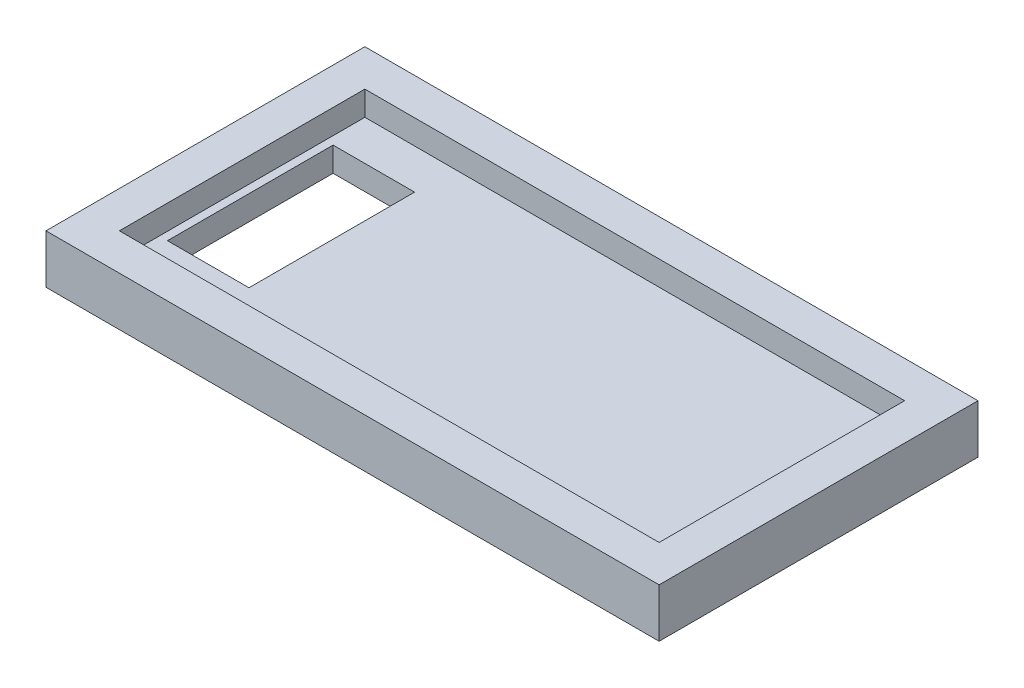
ISO-10303-21;
HEADER;
FILE_DESCRIPTION(('STEP AP214'),'2;1');
FILE_NAME('part.step','',(''),(''),'','','');
FILE_SCHEMA(('AUTOMOTIVE_DESIGN { 1 0 10303 214 1 1 1 1 }'));
ENDSEC;
DATA;
#1=APPLICATION_CONTEXT('core data for automotive mechanical design processes');
#2=APPLICATION_PROTOCOL_DEFINITION('international standard','automotive_design',2000,#1);
#3=PRODUCT_CONTEXT('',#1,'mechanical');
#4=PRODUCT('Part','Part','',(#3));
#5=PRODUCT_RELATED_PRODUCT_CATEGORY('part','',(#4));
#6=PRODUCT_DEFINITION_FORMATION('','',#4);
#7=PRODUCT_DEFINITION_CONTEXT('part definition',#1,'design');
#8=PRODUCT_DEFINITION('design','',#6,#7);
#9=PRODUCT_DEFINITION_SHAPE('','',#8);
#10=(LENGTH_UNIT() NAMED_UNIT(*) SI_UNIT(.MILLI.,.METRE.));
#11=(NAMED_UNIT(*) PLANE_ANGLE_UNIT() SI_UNIT($,.RADIAN.));
#12=(NAMED_UNIT(*) SI_UNIT($,.STERADIAN.) SOLID_ANGLE_UNIT());
#13=UNCERTAINTY_MEASURE_WITH_UNIT(LENGTH_MEASURE(1.E-05),#10,'distance_accuracy_value','');
#14=(GEOMETRIC_REPRESENTATION_CONTEXT(3) GLOBAL_UNCERTAINTY_ASSIGNED_CONTEXT((#13)) GLOBAL_UNIT_ASSIGNED_CONTEXT((#10,
#11,#12)) REPRESENTATION_CONTEXT('',''));
#15=CARTESIAN_POINT('',(0.,0.,0.));
#16=DIRECTION('',(0.,0.,1.));
#17=DIRECTION('',(1.,0.,0.));
#18=AXIS2_PLACEMENT_3D('',#15,#16,#17);
#19=CARTESIAN_POINT('',(0.,0.,0.));
#20=DIRECTION('',(0.,-1.,0.));
#21=DIRECTION('',(0.,0.,-1.));
#22=AXIS2_PLACEMENT_3D('',#19,#20,#21);
#23=PLANE('',#22);
#24=CARTESIAN_POINT('',(-17.68,0.,-8.65499999999999));
#25=DIRECTION('',(0.,1.,0.));
#26=DIRECTION('',(0.,0.,1.));
#27=AXIS2_PLACEMENT_3D('',#24,#25,#26);
#28=CIRCLE('',#27,0.750000000000002);
#29=CARTESIAN_POINT('',(-17.68,0.,-7.90499999999998));
#30=VERTEX_POINT('',#29);
#31=EDGE_CURVE('E414',#30,#30,#28,.T.);
#32=ORIENTED_EDGE('',*,*,#31,.T.);
#33=EDGE_LOOP('',(#32));
#34=FACE_BOUND('',#33,.T.);
#35=CARTESIAN_POINT('',(17.68,0.,-8.655));
#36=DIRECTION('',(0.,1.,0.));
#37=DIRECTION('',(0.,0.,1.));
#38=AXIS2_PLACEMENT_3D('',#35,#36,#37);
#39=CIRCLE('',#38,0.750000000000002);
#40=CARTESIAN_POINT('',(17.68,0.,-7.90499999999999));
#41=VERTEX_POINT('',#40);
#42=EDGE_CURVE('E413',#41,#41,#39,.T.);
#43=ORIENTED_EDGE('',*,*,#42,.T.);
#44=EDGE_LOOP('',(#43));
#45=FACE_BOUND('',#44,.T.);
#46=CARTESIAN_POINT('',(17.68,0.,8.655));
#47=DIRECTION('',(0.,1.,0.));
#48=DIRECTION('',(0.,0.,1.));
#49=AXIS2_PLACEMENT_3D('',#46,#47,#48);
#50=CIRCLE('',#49,0.750000000000002);
#51=CARTESIAN_POINT('',(17.68,0.,9.405));
#52=VERTEX_POINT('',#51);
#53=EDGE_CURVE('E429',#52,#52,#50,.T.);
#54=ORIENTED_EDGE('',*,*,#53,.T.);
#55=EDGE_LOOP('',(#54));
#56=FACE_BOUND('',#55,.T.);
#57=CARTESIAN_POINT('',(-17.68,0.,8.655));
#58=DIRECTION('',(0.,1.,0.));
#59=DIRECTION('',(0.,0.,1.));
#60=AXIS2_PLACEMENT_3D('',#57,#58,#59);
#61=CIRCLE('',#60,0.750000000000002);
#62=CARTESIAN_POINT('',(-17.68,0.,9.405));
#63=VERTEX_POINT('',#62);
#64=EDGE_CURVE('E423',#63,#63,#61,.T.);
#65=ORIENTED_EDGE('',*,*,#64,.T.);
#66=EDGE_LOOP('',(#65));
#67=FACE_BOUND('',#66,.T.);
#68=DIRECTION('',(0.,0.,-1.));
#69=VECTOR('',#68,1.);
#70=CARTESIAN_POINT('',(18.805,0.,9.78));
#71=LINE('',#70,#69);
#72=CARTESIAN_POINT('',(18.805,0.,9.78));
#73=VERTEX_POINT('',#72);
#74=CARTESIAN_POINT('',(18.805,0.,-9.78));
#75=VERTEX_POINT('',#74);
#76=EDGE_CURVE('E185',#73,#75,#71,.T.);
#77=ORIENTED_EDGE('',*,*,#76,.F.);
#78=DIRECTION('',(1.,0.,0.));
#79=VECTOR('',#78,1.);
#80=CARTESIAN_POINT('',(-18.805,0.,9.78));
#81=LINE('',#80,#79);
#82=CARTESIAN_POINT('',(-18.805,0.,9.78));
#83=VERTEX_POINT('',#82);
#84=EDGE_CURVE('E196',#83,#73,#81,.T.);
#85=ORIENTED_EDGE('',*,*,#84,.F.);
#86=DIRECTION('',(0.,0.,1.));
#87=VECTOR('',#86,1.);
#88=CARTESIAN_POINT('',(-18.805,0.,9.78));
#89=LINE('',#88,#87);
#90=CARTESIAN_POINT('',(-18.805,0.,-9.78));
#91=VERTEX_POINT('',#90);
#92=EDGE_CURVE('E207',#91,#83,#89,.T.);
#93=ORIENTED_EDGE('',*,*,#92,.F.);
#94=DIRECTION('',(-1.,0.,0.));
#95=VECTOR('',#94,1.);
#96=CARTESIAN_POINT('',(-18.805,0.,-9.78));
#97=LINE('',#96,#95);
#98=EDGE_CURVE('E205',#75,#91,#97,.T.);
#99=ORIENTED_EDGE('',*,*,#98,.F.);
#100=EDGE_LOOP('',(#77,#85,#93,#99));
#101=FACE_BOUND('',#100,.T.);
#102=DIRECTION('',(-1.,0.,0.));
#103=VECTOR('',#102,1.);
#104=CARTESIAN_POINT('',(0.,0.,5.08));
#105=LINE('',#104,#103);
#106=CARTESIAN_POINT('',(-11.055,0.,5.08));
#107=VERTEX_POINT('',#106);
#108=CARTESIAN_POINT('',(-16.055,0.,5.08));
#109=VERTEX_POINT('',#108);
#110=EDGE_CURVE('E130',#107,#109,#105,.T.);
#111=ORIENTED_EDGE('',*,*,#110,.F.);
#112=DIRECTION('',(0.,0.,1.));
#113=VECTOR('',#112,1.);
#114=CARTESIAN_POINT('',(-11.055,0.,0.));
#115=LINE('',#114,#113);
#116=CARTESIAN_POINT('',(-11.055,0.,-5.08));
#117=VERTEX_POINT('',#116);
#118=EDGE_CURVE('E122',#117,#107,#115,.T.);
#119=ORIENTED_EDGE('',*,*,#118,.F.);
#120=DIRECTION('',(1.,0.,0.));
#121=VECTOR('',#120,1.);
#122=CARTESIAN_POINT('',(0.,0.,-5.08));
#123=LINE('',#122,#121);
#124=CARTESIAN_POINT('',(-16.055,0.,-5.08));
#125=VERTEX_POINT('',#124);
#126=EDGE_CURVE('E144',#125,#117,#123,.T.);
#127=ORIENTED_EDGE('',*,*,#126,.F.);
#128=DIRECTION('',(0.,0.,-1.));
#129=VECTOR('',#128,1.);
#130=CARTESIAN_POINT('',(-16.055,0.,0.));
#131=LINE('',#130,#129);
#132=EDGE_CURVE('E142',#109,#125,#131,.T.);
#133=ORIENTED_EDGE('',*,*,#132,.F.);
#134=EDGE_LOOP('',(#111,#119,#127,#133));
#135=FACE_BOUND('',#134,.T.);
#136=ADVANCED_FACE('F33',(#34,#45,#56,#67,#101,#135),#23,.T.);
#137=CARTESIAN_POINT('',(0.,1.5,0.));
#138=DIRECTION('',(0.,1.,0.));
#139=DIRECTION('',(0.,0.,1.));
#140=AXIS2_PLACEMENT_3D('',#137,#138,#139);
#141=PLANE('',#140);
#142=DIRECTION('',(1.,0.,0.));
#143=VECTOR('',#142,1.);
#144=CARTESIAN_POINT('',(0.,1.5,7.53));
#145=LINE('',#144,#143);
#146=CARTESIAN_POINT('',(-16.555,1.5,7.53));
#147=VERTEX_POINT('',#146);
#148=CARTESIAN_POINT('',(16.555,1.5,7.53));
#149=VERTEX_POINT('',#148);
#150=EDGE_CURVE('E160',#147,#149,#145,.T.);
#151=ORIENTED_EDGE('',*,*,#150,.T.);
#152=DIRECTION('',(0.,0.,-1.));
#153=VECTOR('',#152,1.);
#154=CARTESIAN_POINT('',(16.555,1.5,0.));
#155=LINE('',#154,#153);
#156=CARTESIAN_POINT('',(16.555,1.5,-7.53));
#157=VERTEX_POINT('',#156);
#158=EDGE_CURVE('E163',#149,#157,#155,.T.);
#159=ORIENTED_EDGE('',*,*,#158,.T.);
#160=DIRECTION('',(-1.,0.,0.));
#161=VECTOR('',#160,1.);
#162=CARTESIAN_POINT('',(0.,1.5,-7.53));
#163=LINE('',#162,#161);
#164=CARTESIAN_POINT('',(-16.555,1.5,-7.53));
#165=VERTEX_POINT('',#164);
#166=EDGE_CURVE('E167',#157,#165,#163,.T.);
#167=ORIENTED_EDGE('',*,*,#166,.T.);
#168=DIRECTION('',(0.,0.,1.));
#169=VECTOR('',#168,1.);
#170=CARTESIAN_POINT('',(-16.555,1.5,0.));
#171=LINE('',#170,#169);
#172=EDGE_CURVE('E170',#165,#147,#171,.T.);
#173=ORIENTED_EDGE('',*,*,#172,.T.);
#174=EDGE_LOOP('',(#151,#159,#167,#173));
#175=FACE_BOUND('',#174,.T.);
#176=DIRECTION('',(1.,0.,0.));
#177=VECTOR('',#176,1.);
#178=CARTESIAN_POINT('',(0.,1.5,-5.08));
#179=LINE('',#178,#177);
#180=CARTESIAN_POINT('',(-16.055,1.5,-5.08));
#181=VERTEX_POINT('',#180);
#182=CARTESIAN_POINT('',(-11.055,1.5,-5.08));
#183=VERTEX_POINT('',#182);
#184=EDGE_CURVE('E131',#181,#183,#179,.T.);
#185=ORIENTED_EDGE('',*,*,#184,.T.);
#186=DIRECTION('',(0.,0.,1.));
#187=VECTOR('',#186,1.);
#188=CARTESIAN_POINT('',(-11.055,1.5,0.));
#189=LINE('',#188,#187);
#190=CARTESIAN_POINT('',(-11.055,1.5,5.08));
#191=VERTEX_POINT('',#190);
#192=EDGE_CURVE('E56',#183,#191,#189,.T.);
#193=ORIENTED_EDGE('',*,*,#192,.T.);
#194=DIRECTION('',(-1.,0.,0.));
#195=VECTOR('',#194,1.);
#196=CARTESIAN_POINT('',(0.,1.5,5.08));
#197=LINE('',#196,#195);
#198=CARTESIAN_POINT('',(-16.055,1.5,5.08));
#199=VERTEX_POINT('',#198);
#200=EDGE_CURVE('E137',#191,#199,#197,.T.);
#201=ORIENTED_EDGE('',*,*,#200,.T.);
#202=DIRECTION('',(0.,0.,-1.));
#203=VECTOR('',#202,1.);
#204=CARTESIAN_POINT('',(-16.055,1.5,0.));
#205=LINE('',#204,#203);
#206=EDGE_CURVE('E152',#199,#181,#205,.T.);
#207=ORIENTED_EDGE('',*,*,#206,.T.);
#208=EDGE_LOOP('',(#185,#193,#201,#207));
#209=FACE_BOUND('',#208,.T.);
#210=ADVANCED_FACE('F241',(#175,#209),#141,.T.);
#211=CARTESIAN_POINT('',(18.805,3.,9.78));
#212=DIRECTION('',(-1.,0.,0.));
#213=DIRECTION('',(0.,0.,1.));
#214=AXIS2_PLACEMENT_3D('',#211,#212,#213);
#215=PLANE('',#214);
#216=ORIENTED_EDGE('',*,*,#76,.T.);
#217=DIRECTION('',(0.,-1.,0.));
#218=VECTOR('',#217,1.);
#219=CARTESIAN_POINT('',(18.805,3.,-9.78));
#220=LINE('',#219,#218);
#221=CARTESIAN_POINT('',(18.805,3.,-9.78));
#222=VERTEX_POINT('',#221);
#223=EDGE_CURVE('E11',#222,#75,#220,.T.);
#224=ORIENTED_EDGE('',*,*,#223,.F.);
#225=DIRECTION('',(0.,0.,-1.));
#226=VECTOR('',#225,1.);
#227=CARTESIAN_POINT('',(18.805,3.,9.78));
#228=LINE('',#227,#226);
#229=CARTESIAN_POINT('',(18.805,3.,9.78));
#230=VERTEX_POINT('',#229);
#231=EDGE_CURVE('E192',#230,#222,#228,.T.);
#232=ORIENTED_EDGE('',*,*,#231,.F.);
#233=DIRECTION('',(0.,-1.,0.));
#234=VECTOR('',#233,1.);
#235=CARTESIAN_POINT('',(18.805,3.,9.78));
#236=LINE('',#235,#234);
#237=EDGE_CURVE('E202',#230,#73,#236,.T.);
#238=ORIENTED_EDGE('',*,*,#237,.T.);
#239=EDGE_LOOP('',(#216,#224,#232,#238));
#240=FACE_BOUND('',#239,.T.);
#241=ADVANCED_FACE('F35',(#240),#215,.F.);
#242=CARTESIAN_POINT('',(-18.805,3.,-9.78));
#243=DIRECTION('',(0.,0.,1.));
#244=DIRECTION('',(1.,0.,0.));
#245=AXIS2_PLACEMENT_3D('',#242,#243,#244);
#246=PLANE('',#245);
#247=ORIENTED_EDGE('',*,*,#98,.T.);
#248=DIRECTION('',(0.,-1.,0.));
#249=VECTOR('',#248,1.);
#250=CARTESIAN_POINT('',(-18.805,3.,-9.78));
#251=LINE('',#250,#249);
#252=CARTESIAN_POINT('',(-18.805,3.,-9.78));
#253=VERTEX_POINT('',#252);
#254=EDGE_CURVE('E41',#253,#91,#251,.T.);
#255=ORIENTED_EDGE('',*,*,#254,.F.);
#256=DIRECTION('',(-1.,0.,0.));
#257=VECTOR('',#256,1.);
#258=CARTESIAN_POINT('',(-18.805,3.,-9.78));
#259=LINE('',#258,#257);
#260=EDGE_CURVE('E195',#222,#253,#259,.T.);
#261=ORIENTED_EDGE('',*,*,#260,.F.);
#262=ORIENTED_EDGE('',*,*,#223,.T.);
#263=EDGE_LOOP('',(#247,#255,#261,#262));
#264=FACE_BOUND('',#263,.T.);
#265=ADVANCED_FACE('F234',(#264),#246,.F.);
#266=CARTESIAN_POINT('',(-18.805,3.,9.78));
#267=DIRECTION('',(1.,0.,0.));
#268=DIRECTION('',(0.,0.,-1.));
#269=AXIS2_PLACEMENT_3D('',#266,#267,#268);
#270=PLANE('',#269);
#271=ORIENTED_EDGE('',*,*,#92,.T.);
#272=DIRECTION('',(0.,-1.,0.));
#273=VECTOR('',#272,1.);
#274=CARTESIAN_POINT('',(-18.805,3.,9.78));
#275=LINE('',#274,#273);
#276=CARTESIAN_POINT('',(-18.805,3.,9.78));
#277=VERTEX_POINT('',#276);
#278=EDGE_CURVE('E212',#277,#83,#275,.T.);
#279=ORIENTED_EDGE('',*,*,#278,.F.);
#280=DIRECTION('',(0.,0.,1.));
#281=VECTOR('',#280,1.);
#282=CARTESIAN_POINT('',(-18.805,3.,9.78));
#283=LINE('',#282,#281);
#284=EDGE_CURVE('E198',#253,#277,#283,.T.);
#285=ORIENTED_EDGE('',*,*,#284,.F.);
#286=ORIENTED_EDGE('',*,*,#254,.T.);
#287=EDGE_LOOP('',(#271,#279,#285,#286));
#288=FACE_BOUND('',#287,.T.);
#289=ADVANCED_FACE('F219',(#288),#270,.F.);
#290=CARTESIAN_POINT('',(-18.805,3.,9.78));
#291=DIRECTION('',(0.,0.,-1.));
#292=DIRECTION('',(-1.,0.,0.));
#293=AXIS2_PLACEMENT_3D('',#290,#291,#292);
#294=PLANE('',#293);
#295=ORIENTED_EDGE('',*,*,#84,.T.);
#296=ORIENTED_EDGE('',*,*,#237,.F.);
#297=DIRECTION('',(1.,0.,0.));
#298=VECTOR('',#297,1.);
#299=CARTESIAN_POINT('',(-18.805,3.,9.78));
#300=LINE('',#299,#298);
#301=EDGE_CURVE('E200',#277,#230,#300,.T.);
#302=ORIENTED_EDGE('',*,*,#301,.F.);
#303=ORIENTED_EDGE('',*,*,#278,.T.);
#304=EDGE_LOOP('',(#295,#296,#302,#303));
#305=FACE_BOUND('',#304,.T.);
#306=ADVANCED_FACE('F227',(#305),#294,.F.);
#307=CARTESIAN_POINT('',(0.,3.,0.));
#308=DIRECTION('',(0.,-1.,0.));
#309=DIRECTION('',(0.,0.,-1.));
#310=AXIS2_PLACEMENT_3D('',#307,#308,#309);
#311=PLANE('',#310);
#312=DIRECTION('',(0.,0.,-1.));
#313=VECTOR('',#312,1.);
#314=CARTESIAN_POINT('',(16.555,3.,0.));
#315=LINE('',#314,#313);
#316=CARTESIAN_POINT('',(16.555,3.,7.53));
#317=VERTEX_POINT('',#316);
#318=CARTESIAN_POINT('',(16.555,3.,-7.53));
#319=VERTEX_POINT('',#318);
#320=EDGE_CURVE('E175',#317,#319,#315,.T.);
#321=ORIENTED_EDGE('',*,*,#320,.F.);
#322=DIRECTION('',(1.,0.,0.));
#323=VECTOR('',#322,1.);
#324=CARTESIAN_POINT('',(0.,3.,7.53));
#325=LINE('',#324,#323);
#326=CARTESIAN_POINT('',(-16.555,3.,7.53));
#327=VERTEX_POINT('',#326);
#328=EDGE_CURVE('E138',#327,#317,#325,.T.);
#329=ORIENTED_EDGE('',*,*,#328,.F.);
#330=DIRECTION('',(0.,0.,1.));
#331=VECTOR('',#330,1.);
#332=CARTESIAN_POINT('',(-16.555,3.,0.));
#333=LINE('',#332,#331);
#334=CARTESIAN_POINT('',(-16.555,3.,-7.53));
#335=VERTEX_POINT('',#334);
#336=EDGE_CURVE('E164',#335,#327,#333,.T.);
#337=ORIENTED_EDGE('',*,*,#336,.F.);
#338=DIRECTION('',(-1.,0.,0.));
#339=VECTOR('',#338,1.);
#340=CARTESIAN_POINT('',(0.,3.,-7.53));
#341=LINE('',#340,#339);
#342=EDGE_CURVE('E178',#319,#335,#341,.T.);
#343=ORIENTED_EDGE('',*,*,#342,.F.);
#344=EDGE_LOOP('',(#321,#329,#337,#343));
#345=FACE_BOUND('',#344,.T.);
#346=ORIENTED_EDGE('',*,*,#231,.T.);
#347=ORIENTED_EDGE('',*,*,#260,.T.);
#348=ORIENTED_EDGE('',*,*,#284,.T.);
#349=ORIENTED_EDGE('',*,*,#301,.T.);
#350=EDGE_LOOP('',(#346,#347,#348,#349));
#351=FACE_BOUND('',#350,.T.);
#352=ADVANCED_FACE('F233',(#345,#351),#311,.F.);
#353=CARTESIAN_POINT('',(0.,1.5,7.53));
#354=DIRECTION('',(0.,0.,1.));
#355=DIRECTION('',(1.,0.,0.));
#356=AXIS2_PLACEMENT_3D('',#353,#354,#355);
#357=PLANE('',#356);
#358=ORIENTED_EDGE('',*,*,#328,.T.);
#359=DIRECTION('',(0.,1.,0.));
#360=VECTOR('',#359,1.);
#361=CARTESIAN_POINT('',(16.555,1.5,7.53));
#362=LINE('',#361,#360);
#363=EDGE_CURVE('E173',#149,#317,#362,.T.);
#364=ORIENTED_EDGE('',*,*,#363,.F.);
#365=ORIENTED_EDGE('',*,*,#150,.F.);
#366=DIRECTION('',(0.,1.,0.));
#367=VECTOR('',#366,1.);
#368=CARTESIAN_POINT('',(-16.555,1.5,7.53));
#369=LINE('',#368,#367);
#370=EDGE_CURVE('E183',#147,#327,#369,.T.);
#371=ORIENTED_EDGE('',*,*,#370,.T.);
#372=EDGE_LOOP('',(#358,#364,#365,#371));
#373=FACE_BOUND('',#372,.T.);
#374=ADVANCED_FACE('F259',(#373),#357,.F.);
#375=CARTESIAN_POINT('',(-16.555,1.5,0.));
#376=DIRECTION('',(-1.,0.,0.));
#377=DIRECTION('',(0.,0.,1.));
#378=AXIS2_PLACEMENT_3D('',#375,#376,#377);
#379=PLANE('',#378);
#380=ORIENTED_EDGE('',*,*,#336,.T.);
#381=ORIENTED_EDGE('',*,*,#370,.F.);
#382=ORIENTED_EDGE('',*,*,#172,.F.);
#383=DIRECTION('',(0.,1.,0.));
#384=VECTOR('',#383,1.);
#385=CARTESIAN_POINT('',(-16.555,1.5,-7.53));
#386=LINE('',#385,#384);
#387=EDGE_CURVE('E186',#165,#335,#386,.T.);
#388=ORIENTED_EDGE('',*,*,#387,.T.);
#389=EDGE_LOOP('',(#380,#381,#382,#388));
#390=FACE_BOUND('',#389,.T.);
#391=ADVANCED_FACE('F264',(#390),#379,.F.);
#392=CARTESIAN_POINT('',(0.,1.5,-7.53));
#393=DIRECTION('',(0.,0.,-1.));
#394=DIRECTION('',(-1.,0.,0.));
#395=AXIS2_PLACEMENT_3D('',#392,#393,#394);
#396=PLANE('',#395);
#397=ORIENTED_EDGE('',*,*,#342,.T.);
#398=ORIENTED_EDGE('',*,*,#387,.F.);
#399=ORIENTED_EDGE('',*,*,#166,.F.);
#400=DIRECTION('',(0.,1.,0.));
#401=VECTOR('',#400,1.);
#402=CARTESIAN_POINT('',(16.555,1.5,-7.53));
#403=LINE('',#402,#401);
#404=EDGE_CURVE('E188',#157,#319,#403,.T.);
#405=ORIENTED_EDGE('',*,*,#404,.T.);
#406=EDGE_LOOP('',(#397,#398,#399,#405));
#407=FACE_BOUND('',#406,.T.);
#408=ADVANCED_FACE('F278',(#407),#396,.F.);
#409=CARTESIAN_POINT('',(16.555,1.5,0.));
#410=DIRECTION('',(1.,0.,0.));
#411=DIRECTION('',(0.,0.,-1.));
#412=AXIS2_PLACEMENT_3D('',#409,#410,#411);
#413=PLANE('',#412);
#414=ORIENTED_EDGE('',*,*,#320,.T.);
#415=ORIENTED_EDGE('',*,*,#404,.F.);
#416=ORIENTED_EDGE('',*,*,#158,.F.);
#417=ORIENTED_EDGE('',*,*,#363,.T.);
#418=EDGE_LOOP('',(#414,#415,#416,#417));
#419=FACE_BOUND('',#418,.T.);
#420=ADVANCED_FACE('F271',(#419),#413,.F.);
#421=CARTESIAN_POINT('',(-11.055,0.,0.));
#422=DIRECTION('',(-1.,0.,0.));
#423=DIRECTION('',(0.,0.,1.));
#424=AXIS2_PLACEMENT_3D('',#421,#422,#423);
#425=PLANE('',#424);
#426=ORIENTED_EDGE('',*,*,#192,.F.);
#427=DIRECTION('',(0.,1.,0.));
#428=VECTOR('',#427,1.);
#429=CARTESIAN_POINT('',(-11.055,0.,-5.08));
#430=LINE('',#429,#428);
#431=EDGE_CURVE('E126',#117,#183,#430,.T.);
#432=ORIENTED_EDGE('',*,*,#431,.F.);
#433=ORIENTED_EDGE('',*,*,#118,.T.);
#434=DIRECTION('',(0.,1.,0.));
#435=VECTOR('',#434,1.);
#436=CARTESIAN_POINT('',(-11.055,0.,5.08));
#437=LINE('',#436,#435);
#438=EDGE_CURVE('E125',#107,#191,#437,.T.);
#439=ORIENTED_EDGE('',*,*,#438,.T.);
#440=EDGE_LOOP('',(#426,#432,#433,#439));
#441=FACE_BOUND('',#440,.T.);
#442=ADVANCED_FACE('F124',(#441),#425,.T.);
#443=CARTESIAN_POINT('',(0.,0.,5.08));
#444=DIRECTION('',(0.,0.,-1.));
#445=DIRECTION('',(-1.,0.,0.));
#446=AXIS2_PLACEMENT_3D('',#443,#444,#445);
#447=PLANE('',#446);
#448=ORIENTED_EDGE('',*,*,#200,.F.);
#449=ORIENTED_EDGE('',*,*,#438,.F.);
#450=ORIENTED_EDGE('',*,*,#110,.T.);
#451=DIRECTION('',(0.,1.,0.));
#452=VECTOR('',#451,1.);
#453=CARTESIAN_POINT('',(-16.055,0.,5.08));
#454=LINE('',#453,#452);
#455=EDGE_CURVE('E139',#109,#199,#454,.T.);
#456=ORIENTED_EDGE('',*,*,#455,.T.);
#457=EDGE_LOOP('',(#448,#449,#450,#456));
#458=FACE_BOUND('',#457,.T.);
#459=ADVANCED_FACE('F134',(#458),#447,.T.);
#460=CARTESIAN_POINT('',(-16.055,0.,0.));
#461=DIRECTION('',(1.,0.,0.));
#462=DIRECTION('',(0.,0.,-1.));
#463=AXIS2_PLACEMENT_3D('',#460,#461,#462);
#464=PLANE('',#463);
#465=ORIENTED_EDGE('',*,*,#206,.F.);
#466=ORIENTED_EDGE('',*,*,#455,.F.);
#467=ORIENTED_EDGE('',*,*,#132,.T.);
#468=DIRECTION('',(0.,1.,0.));
#469=VECTOR('',#468,1.);
#470=CARTESIAN_POINT('',(-16.055,0.,-5.08));
#471=LINE('',#470,#469);
#472=EDGE_CURVE('E48',#125,#181,#471,.T.);
#473=ORIENTED_EDGE('',*,*,#472,.T.);
#474=EDGE_LOOP('',(#465,#466,#467,#473));
#475=FACE_BOUND('',#474,.T.);
#476=ADVANCED_FACE('F284',(#475),#464,.T.);
#477=CARTESIAN_POINT('',(0.,0.,-5.08));
#478=DIRECTION('',(0.,0.,1.));
#479=DIRECTION('',(1.,0.,0.));
#480=AXIS2_PLACEMENT_3D('',#477,#478,#479);
#481=PLANE('',#480);
#482=ORIENTED_EDGE('',*,*,#184,.F.);
#483=ORIENTED_EDGE('',*,*,#472,.F.);
#484=ORIENTED_EDGE('',*,*,#126,.T.);
#485=ORIENTED_EDGE('',*,*,#431,.T.);
#486=EDGE_LOOP('',(#482,#483,#484,#485));
#487=FACE_BOUND('',#486,.T.);
#488=ADVANCED_FACE('F281',(#487),#481,.T.);
#489=CARTESIAN_POINT('',(-17.68,2.,8.655));
#490=DIRECTION('',(0.,-1.,0.));
#491=DIRECTION('',(0.,0.,-1.));
#492=AXIS2_PLACEMENT_3D('',#489,#490,#491);
#493=CYLINDRICAL_SURFACE('',#492,0.750000000000002);
#494=CARTESIAN_POINT('',(-17.68,2.,8.655));
#495=DIRECTION('',(0.,1.,0.));
#496=DIRECTION('',(0.,0.,1.));
#497=AXIS2_PLACEMENT_3D('',#494,#495,#496);
#498=CIRCLE('',#497,0.750000000000002);
#499=CARTESIAN_POINT('',(-17.68,2.,9.405));
#500=VERTEX_POINT('',#499);
#501=EDGE_CURVE('E150',#500,#500,#498,.T.);
#502=ORIENTED_EDGE('',*,*,#501,.T.);
#503=EDGE_LOOP('',(#502));
#504=FACE_BOUND('',#503,.T.);
#505=ORIENTED_EDGE('',*,*,#64,.F.);
#506=EDGE_LOOP('',(#505));
#507=FACE_BOUND('',#506,.T.);
#508=ADVANCED_FACE('F283',(#504,#507),#493,.F.);
#509=CARTESIAN_POINT('',(-17.68,2.,8.655));
#510=DIRECTION('',(0.,1.,0.));
#511=DIRECTION('',(0.,0.,1.));
#512=AXIS2_PLACEMENT_3D('',#509,#510,#511);
#513=PLANE('',#512);
#514=ORIENTED_EDGE('',*,*,#501,.F.);
#515=EDGE_LOOP('',(#514));
#516=FACE_BOUND('',#515,.T.);
#517=ADVANCED_FACE('F290',(#516),#513,.F.);
#518=CARTESIAN_POINT('',(17.68,2.,8.655));
#519=DIRECTION('',(0.,-1.,0.));
#520=DIRECTION('',(0.,0.,-1.));
#521=AXIS2_PLACEMENT_3D('',#518,#519,#520);
#522=CYLINDRICAL_SURFACE('',#521,0.750000000000002);
#523=CARTESIAN_POINT('',(17.68,2.,8.655));
#524=DIRECTION('',(0.,1.,0.));
#525=DIRECTION('',(0.,0.,1.));
#526=AXIS2_PLACEMENT_3D('',#523,#524,#525);
#527=CIRCLE('',#526,0.750000000000002);
#528=CARTESIAN_POINT('',(17.68,2.,9.405));
#529=VERTEX_POINT('',#528);
#530=EDGE_CURVE('E425',#529,#529,#527,.T.);
#531=ORIENTED_EDGE('',*,*,#530,.T.);
#532=EDGE_LOOP('',(#531));
#533=FACE_BOUND('',#532,.T.);
#534=ORIENTED_EDGE('',*,*,#53,.F.);
#535=EDGE_LOOP('',(#534));
#536=FACE_BOUND('',#535,.T.);
#537=ADVANCED_FACE('F347',(#533,#536),#522,.F.);
#538=CARTESIAN_POINT('',(17.68,2.,8.655));
#539=DIRECTION('',(0.,1.,0.));
#540=DIRECTION('',(0.,0.,1.));
#541=AXIS2_PLACEMENT_3D('',#538,#539,#540);
#542=PLANE('',#541);
#543=ORIENTED_EDGE('',*,*,#530,.F.);
#544=EDGE_LOOP('',(#543));
#545=FACE_BOUND('',#544,.T.);
#546=ADVANCED_FACE('F356',(#545),#542,.F.);
#547=CARTESIAN_POINT('',(17.68,2.,-8.655));
#548=DIRECTION('',(0.,-1.,0.));
#549=DIRECTION('',(0.,0.,-1.));
#550=AXIS2_PLACEMENT_3D('',#547,#548,#549);
#551=CYLINDRICAL_SURFACE('',#550,0.750000000000002);
#552=CARTESIAN_POINT('',(17.68,2.,-8.655));
#553=DIRECTION('',(0.,1.,0.));
#554=DIRECTION('',(0.,0.,1.));
#555=AXIS2_PLACEMENT_3D('',#552,#553,#554);
#556=CIRCLE('',#555,0.750000000000002);
#557=CARTESIAN_POINT('',(17.68,2.,-7.90499999999999));
#558=VERTEX_POINT('',#557);
#559=EDGE_CURVE('E417',#558,#558,#556,.T.);
#560=ORIENTED_EDGE('',*,*,#559,.T.);
#561=EDGE_LOOP('',(#560));
#562=FACE_BOUND('',#561,.T.);
#563=ORIENTED_EDGE('',*,*,#42,.F.);
#564=EDGE_LOOP('',(#563));
#565=FACE_BOUND('',#564,.T.);
#566=ADVANCED_FACE('F366',(#562,#565),#551,.F.);
#567=CARTESIAN_POINT('',(17.68,2.,-8.655));
#568=DIRECTION('',(0.,1.,0.));
#569=DIRECTION('',(0.,0.,1.));
#570=AXIS2_PLACEMENT_3D('',#567,#568,#569);
#571=PLANE('',#570);
#572=ORIENTED_EDGE('',*,*,#559,.F.);
#573=EDGE_LOOP('',(#572));
#574=FACE_BOUND('',#573,.T.);
#575=ADVANCED_FACE('F376',(#574),#571,.F.);
#576=CARTESIAN_POINT('',(-17.68,2.,-8.65499999999999));
#577=DIRECTION('',(0.,-1.,0.));
#578=DIRECTION('',(0.,0.,-1.));
#579=AXIS2_PLACEMENT_3D('',#576,#577,#578);
#580=CYLINDRICAL_SURFACE('',#579,0.750000000000002);
#581=CARTESIAN_POINT('',(-17.68,2.,-8.65499999999999));
#582=DIRECTION('',(0.,1.,0.));
#583=DIRECTION('',(0.,0.,1.));
#584=AXIS2_PLACEMENT_3D('',#581,#582,#583);
#585=CIRCLE('',#584,0.750000000000002);
#586=CARTESIAN_POINT('',(-17.68,2.,-7.90499999999998));
#587=VERTEX_POINT('',#586);
#588=EDGE_CURVE('E412',#587,#587,#585,.T.);
#589=ORIENTED_EDGE('',*,*,#588,.T.);
#590=EDGE_LOOP('',(#589));
#591=FACE_BOUND('',#590,.T.);
#592=ORIENTED_EDGE('',*,*,#31,.F.);
#593=EDGE_LOOP('',(#592));
#594=FACE_BOUND('',#593,.T.);
#595=ADVANCED_FACE('F386',(#591,#594),#580,.F.);
#596=CARTESIAN_POINT('',(-17.68,2.,-8.65499999999999));
#597=DIRECTION('',(0.,1.,0.));
#598=DIRECTION('',(0.,0.,1.));
#599=AXIS2_PLACEMENT_3D('',#596,#597,#598);
#600=PLANE('',#599);
#601=ORIENTED_EDGE('',*,*,#588,.F.);
#602=EDGE_LOOP('',(#601));
#603=FACE_BOUND('',#602,.T.);
#604=ADVANCED_FACE('F396',(#603),#600,.F.);
#605=CLOSED_SHELL('',(#136,#210,#241,#265,#289,#306,#352,#374,#391,#408,#420,#442,#459,#476,
#488,#508,#517,#537,#546,#566,#575,#595,#604));
#606=MANIFOLD_SOLID_BREP('B2',#605);
#607=ADVANCED_BREP_SHAPE_REPRESENTATION('',(#18,#606),#14);
#608=SHAPE_DEFINITION_REPRESENTATION(#9,#607);
ENDSEC;
END-ISO-10303-21;
